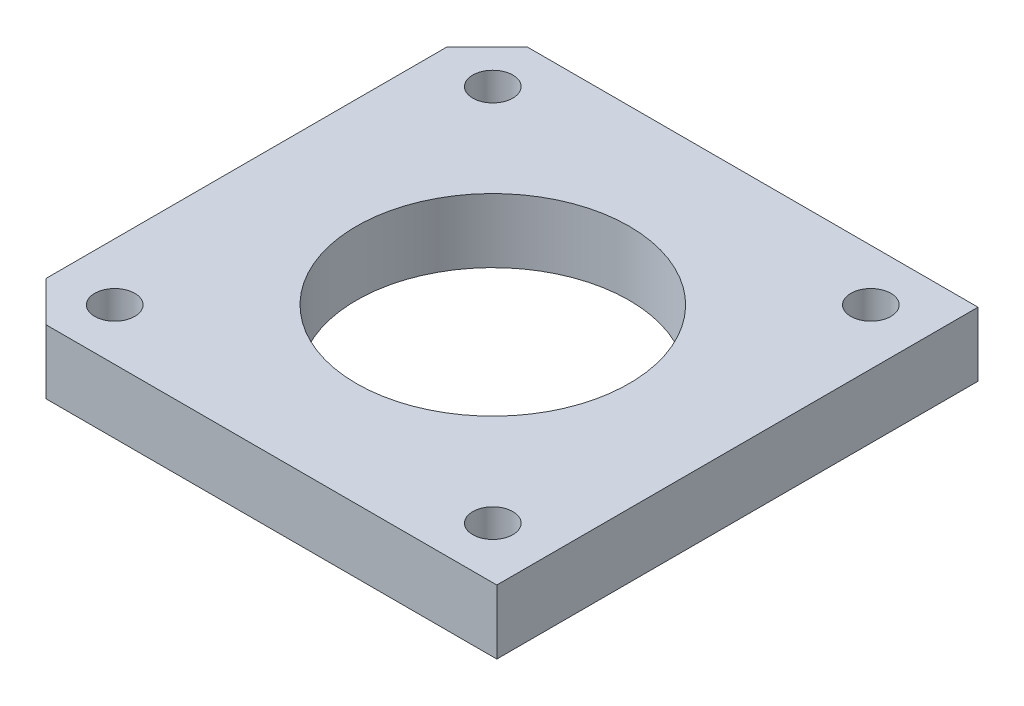
ISO-10303-21;
HEADER;
FILE_DESCRIPTION(('STEP AP214'),'2;1');
FILE_NAME('part.step','',(''),(''),'','','');
FILE_SCHEMA(('AUTOMOTIVE_DESIGN { 1 0 10303 214 1 1 1 1 }'));
ENDSEC;
DATA;
#1=APPLICATION_CONTEXT('core data for automotive mechanical design processes');
#2=APPLICATION_PROTOCOL_DEFINITION('international standard','automotive_design',2000,#1);
#3=PRODUCT_CONTEXT('',#1,'mechanical');
#4=PRODUCT('Part','Part','',(#3));
#5=PRODUCT_RELATED_PRODUCT_CATEGORY('part','',(#4));
#6=PRODUCT_DEFINITION_FORMATION('','',#4);
#7=PRODUCT_DEFINITION_CONTEXT('part definition',#1,'design');
#8=PRODUCT_DEFINITION('design','',#6,#7);
#9=PRODUCT_DEFINITION_SHAPE('','',#8);
#10=(LENGTH_UNIT() NAMED_UNIT(*) SI_UNIT(.MILLI.,.METRE.));
#11=(NAMED_UNIT(*) PLANE_ANGLE_UNIT() SI_UNIT($,.RADIAN.));
#12=(NAMED_UNIT(*) SI_UNIT($,.STERADIAN.) SOLID_ANGLE_UNIT());
#13=UNCERTAINTY_MEASURE_WITH_UNIT(LENGTH_MEASURE(1.E-05),#10,'distance_accuracy_value','');
#14=(GEOMETRIC_REPRESENTATION_CONTEXT(3) GLOBAL_UNCERTAINTY_ASSIGNED_CONTEXT((#13)) GLOBAL_UNIT_ASSIGNED_CONTEXT((#10,
#11,#12)) REPRESENTATION_CONTEXT('',''));
#15=CARTESIAN_POINT('',(0.,0.,0.));
#16=DIRECTION('',(0.,0.,1.));
#17=DIRECTION('',(1.,0.,0.));
#18=AXIS2_PLACEMENT_3D('',#15,#16,#17);
#19=CARTESIAN_POINT('',(42.5,8.,30.));
#20=DIRECTION('',(-1.,0.,0.));
#21=DIRECTION('',(0.,0.,1.));
#22=AXIS2_PLACEMENT_3D('',#19,#20,#21);
#23=PLANE('',#22);
#24=DIRECTION('',(0.,0.,-1.));
#25=VECTOR('',#24,1.);
#26=CARTESIAN_POINT('',(42.5,0.,30.));
#27=LINE('',#26,#25);
#28=CARTESIAN_POINT('',(42.5,0.,30.));
#29=VERTEX_POINT('',#28);
#30=CARTESIAN_POINT('',(42.5,0.,-30.));
#31=VERTEX_POINT('',#30);
#32=EDGE_CURVE('E103',#29,#31,#27,.T.);
#33=ORIENTED_EDGE('',*,*,#32,.T.);
#34=DIRECTION('',(0.,-1.,0.));
#35=VECTOR('',#34,1.);
#36=CARTESIAN_POINT('',(42.5,8.,-30.));
#37=LINE('',#36,#35);
#38=CARTESIAN_POINT('',(42.5,8.,-30.));
#39=VERTEX_POINT('',#38);
#40=EDGE_CURVE('E88',#39,#31,#37,.T.);
#41=ORIENTED_EDGE('',*,*,#40,.F.);
#42=DIRECTION('',(0.,0.,-1.));
#43=VECTOR('',#42,1.);
#44=CARTESIAN_POINT('',(42.5,8.,30.));
#45=LINE('',#44,#43);
#46=CARTESIAN_POINT('',(42.5,8.,30.));
#47=VERTEX_POINT('',#46);
#48=EDGE_CURVE('E92',#47,#39,#45,.T.);
#49=ORIENTED_EDGE('',*,*,#48,.F.);
#50=DIRECTION('',(0.,-1.,0.));
#51=VECTOR('',#50,1.);
#52=CARTESIAN_POINT('',(42.5,8.,30.));
#53=LINE('',#52,#51);
#54=EDGE_CURVE('E105',#47,#29,#53,.T.);
#55=ORIENTED_EDGE('',*,*,#54,.T.);
#56=EDGE_LOOP('',(#33,#41,#49,#55));
#57=FACE_BOUND('',#56,.T.);
#58=ADVANCED_FACE('F31',(#57),#23,.F.);
#59=CARTESIAN_POINT('',(-18.7102306116545,8.,-30.));
#60=DIRECTION('',(0.,0.,1.));
#61=DIRECTION('',(1.,0.,0.));
#62=AXIS2_PLACEMENT_3D('',#59,#60,#61);
#63=PLANE('',#62);
#64=DIRECTION('',(-1.,0.,0.));
#65=VECTOR('',#64,1.);
#66=CARTESIAN_POINT('',(-18.7102306116545,0.,-30.));
#67=LINE('',#66,#65);
#68=CARTESIAN_POINT('',(-13.7102306116545,0.,-30.));
#69=VERTEX_POINT('',#68);
#70=EDGE_CURVE('E131',#31,#69,#67,.T.);
#71=ORIENTED_EDGE('',*,*,#70,.T.);
#72=DIRECTION('',(0.,1.,0.));
#73=VECTOR('',#72,1.);
#74=CARTESIAN_POINT('',(-13.7102306116545,8.,-30.));
#75=LINE('',#74,#73);
#76=CARTESIAN_POINT('',(-13.7102306116545,8.,-30.));
#77=VERTEX_POINT('',#76);
#78=EDGE_CURVE('E54',#69,#77,#75,.T.);
#79=ORIENTED_EDGE('',*,*,#78,.T.);
#80=DIRECTION('',(-1.,0.,0.));
#81=VECTOR('',#80,1.);
#82=CARTESIAN_POINT('',(-18.7102306116545,8.,-30.));
#83=LINE('',#82,#81);
#84=EDGE_CURVE('E84',#39,#77,#83,.T.);
#85=ORIENTED_EDGE('',*,*,#84,.F.);
#86=ORIENTED_EDGE('',*,*,#40,.T.);
#87=EDGE_LOOP('',(#71,#79,#85,#86));
#88=FACE_BOUND('',#87,.T.);
#89=ADVANCED_FACE('F86',(#88),#63,.F.);
#90=CARTESIAN_POINT('',(-18.7102306116545,8.,30.));
#91=DIRECTION('',(1.,0.,0.));
#92=DIRECTION('',(0.,0.,-1.));
#93=AXIS2_PLACEMENT_3D('',#90,#91,#92);
#94=PLANE('',#93);
#95=DIRECTION('',(0.,0.,1.));
#96=VECTOR('',#95,1.);
#97=CARTESIAN_POINT('',(-18.7102306116545,8.,30.));
#98=LINE('',#97,#96);
#99=CARTESIAN_POINT('',(-18.7102306116545,8.,-25.));
#100=VERTEX_POINT('',#99);
#101=CARTESIAN_POINT('',(-18.7102306116545,8.,25.));
#102=VERTEX_POINT('',#101);
#103=EDGE_CURVE('E91',#100,#102,#98,.T.);
#104=ORIENTED_EDGE('',*,*,#103,.F.);
#105=DIRECTION('',(0.,-1.,0.));
#106=VECTOR('',#105,1.);
#107=CARTESIAN_POINT('',(-18.7102306116545,8.,-25.));
#108=LINE('',#107,#106);
#109=CARTESIAN_POINT('',(-18.7102306116545,0.,-25.));
#110=VERTEX_POINT('',#109);
#111=EDGE_CURVE('E107',#100,#110,#108,.T.);
#112=ORIENTED_EDGE('',*,*,#111,.T.);
#113=DIRECTION('',(0.,0.,1.));
#114=VECTOR('',#113,1.);
#115=CARTESIAN_POINT('',(-18.7102306116545,0.,30.));
#116=LINE('',#115,#114);
#117=CARTESIAN_POINT('',(-18.7102306116545,0.,25.));
#118=VERTEX_POINT('',#117);
#119=EDGE_CURVE('E132',#110,#118,#116,.T.);
#120=ORIENTED_EDGE('',*,*,#119,.T.);
#121=DIRECTION('',(0.,1.,0.));
#122=VECTOR('',#121,1.);
#123=CARTESIAN_POINT('',(-18.7102306116545,8.,25.));
#124=LINE('',#123,#122);
#125=EDGE_CURVE('E104',#118,#102,#124,.T.);
#126=ORIENTED_EDGE('',*,*,#125,.T.);
#127=EDGE_LOOP('',(#104,#112,#120,#126));
#128=FACE_BOUND('',#127,.T.);
#129=ADVANCED_FACE('F123',(#128),#94,.F.);
#130=CARTESIAN_POINT('',(-18.7102306116545,8.,30.));
#131=DIRECTION('',(0.,0.,-1.));
#132=DIRECTION('',(-1.,0.,0.));
#133=AXIS2_PLACEMENT_3D('',#130,#131,#132);
#134=PLANE('',#133);
#135=DIRECTION('',(1.,0.,0.));
#136=VECTOR('',#135,1.);
#137=CARTESIAN_POINT('',(-18.7102306116545,8.,30.));
#138=LINE('',#137,#136);
#139=CARTESIAN_POINT('',(-13.7102306116545,8.,30.));
#140=VERTEX_POINT('',#139);
#141=EDGE_CURVE('E96',#140,#47,#138,.T.);
#142=ORIENTED_EDGE('',*,*,#141,.F.);
#143=DIRECTION('',(0.,-1.,0.));
#144=VECTOR('',#143,1.);
#145=CARTESIAN_POINT('',(-13.7102306116545,8.,30.));
#146=LINE('',#145,#144);
#147=CARTESIAN_POINT('',(-13.7102306116545,0.,30.));
#148=VERTEX_POINT('',#147);
#149=EDGE_CURVE('E11',#140,#148,#146,.T.);
#150=ORIENTED_EDGE('',*,*,#149,.T.);
#151=DIRECTION('',(1.,0.,0.));
#152=VECTOR('',#151,1.);
#153=CARTESIAN_POINT('',(-18.7102306116545,0.,30.));
#154=LINE('',#153,#152);
#155=EDGE_CURVE('E100',#148,#29,#154,.T.);
#156=ORIENTED_EDGE('',*,*,#155,.T.);
#157=ORIENTED_EDGE('',*,*,#54,.F.);
#158=EDGE_LOOP('',(#142,#150,#156,#157));
#159=FACE_BOUND('',#158,.T.);
#160=ADVANCED_FACE('F140',(#159),#134,.F.);
#161=CARTESIAN_POINT('',(42.5,8.,-30.));
#162=DIRECTION('',(0.,-1.,0.));
#163=DIRECTION('',(0.,0.,-1.));
#164=AXIS2_PLACEMENT_3D('',#161,#162,#163);
#165=PLANE('',#164);
#166=CARTESIAN_POINT('',(35.57,8.,23.57));
#167=DIRECTION('',(0.,1.,0.));
#168=DIRECTION('',(0.,0.,1.));
#169=AXIS2_PLACEMENT_3D('',#166,#167,#168);
#170=CIRCLE('',#169,2.49999999999999);
#171=CARTESIAN_POINT('',(35.57,8.,26.07));
#172=VERTEX_POINT('',#171);
#173=EDGE_CURVE('E191',#172,#172,#170,.T.);
#174=ORIENTED_EDGE('',*,*,#173,.F.);
#175=EDGE_LOOP('',(#174));
#176=FACE_BOUND('',#175,.T.);
#177=CARTESIAN_POINT('',(-11.57,8.,23.57));
#178=DIRECTION('',(0.,1.,0.));
#179=DIRECTION('',(0.,0.,1.));
#180=AXIS2_PLACEMENT_3D('',#177,#178,#179);
#181=CIRCLE('',#180,2.5);
#182=CARTESIAN_POINT('',(-11.57,8.,26.07));
#183=VERTEX_POINT('',#182);
#184=EDGE_CURVE('E193',#183,#183,#181,.T.);
#185=ORIENTED_EDGE('',*,*,#184,.F.);
#186=EDGE_LOOP('',(#185));
#187=FACE_BOUND('',#186,.T.);
#188=CARTESIAN_POINT('',(35.57,8.,-23.57));
#189=DIRECTION('',(0.,1.,0.));
#190=DIRECTION('',(0.,0.,1.));
#191=AXIS2_PLACEMENT_3D('',#188,#189,#190);
#192=CIRCLE('',#191,2.49999999999999);
#193=CARTESIAN_POINT('',(35.57,8.,-21.07));
#194=VERTEX_POINT('',#193);
#195=EDGE_CURVE('E199',#194,#194,#192,.T.);
#196=ORIENTED_EDGE('',*,*,#195,.F.);
#197=EDGE_LOOP('',(#196));
#198=FACE_BOUND('',#197,.T.);
#199=CARTESIAN_POINT('',(-11.57,8.,-23.57));
#200=DIRECTION('',(0.,1.,0.));
#201=DIRECTION('',(0.,0.,1.));
#202=AXIS2_PLACEMENT_3D('',#199,#200,#201);
#203=CIRCLE('',#202,2.5);
#204=CARTESIAN_POINT('',(-11.57,8.,-21.07));
#205=VERTEX_POINT('',#204);
#206=EDGE_CURVE('E205',#205,#205,#203,.T.);
#207=ORIENTED_EDGE('',*,*,#206,.F.);
#208=EDGE_LOOP('',(#207));
#209=FACE_BOUND('',#208,.T.);
#210=CARTESIAN_POINT('',(12.,8.,0.));
#211=DIRECTION('',(0.,1.,0.));
#212=DIRECTION('',(0.,0.,1.));
#213=AXIS2_PLACEMENT_3D('',#210,#211,#212);
#214=CIRCLE('',#213,17.);
#215=CARTESIAN_POINT('',(12.,8.,17.));
#216=VERTEX_POINT('',#215);
#217=EDGE_CURVE('E211',#216,#216,#214,.T.);
#218=ORIENTED_EDGE('',*,*,#217,.F.);
#219=EDGE_LOOP('',(#218));
#220=FACE_BOUND('',#219,.T.);
#221=ORIENTED_EDGE('',*,*,#84,.T.);
#222=DIRECTION('',(0.707106781186549,0.,-0.707106781186546));
#223=VECTOR('',#222,1.);
#224=CARTESIAN_POINT('',(-18.7102306116545,8.,-25.));
#225=LINE('',#224,#223);
#226=EDGE_CURVE('E39',#77,#100,#225,.F.);
#227=ORIENTED_EDGE('',*,*,#226,.T.);
#228=ORIENTED_EDGE('',*,*,#103,.T.);
#229=DIRECTION('',(-0.707106781186546,0.,-0.707106781186549));
#230=VECTOR('',#229,1.);
#231=CARTESIAN_POINT('',(-13.7102306116545,8.,30.));
#232=LINE('',#231,#230);
#233=EDGE_CURVE('E46',#102,#140,#232,.F.);
#234=ORIENTED_EDGE('',*,*,#233,.T.);
#235=ORIENTED_EDGE('',*,*,#141,.T.);
#236=ORIENTED_EDGE('',*,*,#48,.T.);
#237=EDGE_LOOP('',(#221,#227,#228,#234,#235,#236));
#238=FACE_BOUND('',#237,.T.);
#239=ADVANCED_FACE('F95',(#176,#187,#198,#209,#220,#238),#165,.F.);
#240=CARTESIAN_POINT('',(42.5,0.,-30.));
#241=DIRECTION('',(0.,-1.,0.));
#242=DIRECTION('',(0.,0.,-1.));
#243=AXIS2_PLACEMENT_3D('',#240,#241,#242);
#244=PLANE('',#243);
#245=CARTESIAN_POINT('',(35.57,0.,23.57));
#246=DIRECTION('',(0.,1.,0.));
#247=DIRECTION('',(0.,0.,1.));
#248=AXIS2_PLACEMENT_3D('',#245,#246,#247);
#249=CIRCLE('',#248,2.49999999999999);
#250=CARTESIAN_POINT('',(35.57,0.,26.07));
#251=VERTEX_POINT('',#250);
#252=EDGE_CURVE('E188',#251,#251,#249,.T.);
#253=ORIENTED_EDGE('',*,*,#252,.T.);
#254=EDGE_LOOP('',(#253));
#255=FACE_BOUND('',#254,.T.);
#256=CARTESIAN_POINT('',(-11.57,0.,23.57));
#257=DIRECTION('',(0.,1.,0.));
#258=DIRECTION('',(0.,0.,1.));
#259=AXIS2_PLACEMENT_3D('',#256,#257,#258);
#260=CIRCLE('',#259,2.5);
#261=CARTESIAN_POINT('',(-11.57,0.,26.07));
#262=VERTEX_POINT('',#261);
#263=EDGE_CURVE('E196',#262,#262,#260,.T.);
#264=ORIENTED_EDGE('',*,*,#263,.T.);
#265=EDGE_LOOP('',(#264));
#266=FACE_BOUND('',#265,.T.);
#267=CARTESIAN_POINT('',(35.57,0.,-23.57));
#268=DIRECTION('',(0.,1.,0.));
#269=DIRECTION('',(0.,0.,1.));
#270=AXIS2_PLACEMENT_3D('',#267,#268,#269);
#271=CIRCLE('',#270,2.49999999999999);
#272=CARTESIAN_POINT('',(35.57,0.,-21.07));
#273=VERTEX_POINT('',#272);
#274=EDGE_CURVE('E202',#273,#273,#271,.T.);
#275=ORIENTED_EDGE('',*,*,#274,.T.);
#276=EDGE_LOOP('',(#275));
#277=FACE_BOUND('',#276,.T.);
#278=CARTESIAN_POINT('',(-11.57,0.,-23.57));
#279=DIRECTION('',(0.,1.,0.));
#280=DIRECTION('',(0.,0.,1.));
#281=AXIS2_PLACEMENT_3D('',#278,#279,#280);
#282=CIRCLE('',#281,2.5);
#283=CARTESIAN_POINT('',(-11.57,0.,-21.07));
#284=VERTEX_POINT('',#283);
#285=EDGE_CURVE('E208',#284,#284,#282,.T.);
#286=ORIENTED_EDGE('',*,*,#285,.T.);
#287=EDGE_LOOP('',(#286));
#288=FACE_BOUND('',#287,.T.);
#289=CARTESIAN_POINT('',(12.,0.,0.));
#290=DIRECTION('',(0.,1.,0.));
#291=DIRECTION('',(0.,0.,1.));
#292=AXIS2_PLACEMENT_3D('',#289,#290,#291);
#293=CIRCLE('',#292,17.);
#294=CARTESIAN_POINT('',(12.,0.,17.));
#295=VERTEX_POINT('',#294);
#296=EDGE_CURVE('E135',#295,#295,#293,.T.);
#297=ORIENTED_EDGE('',*,*,#296,.T.);
#298=EDGE_LOOP('',(#297));
#299=FACE_BOUND('',#298,.T.);
#300=ORIENTED_EDGE('',*,*,#119,.F.);
#301=DIRECTION('',(-0.707106781186549,0.,0.707106781186546));
#302=VECTOR('',#301,1.);
#303=CARTESIAN_POINT('',(14.3948846941728,0.,-58.1051153058273));
#304=LINE('',#303,#302);
#305=EDGE_CURVE('E116',#110,#69,#304,.F.);
#306=ORIENTED_EDGE('',*,*,#305,.T.);
#307=ORIENTED_EDGE('',*,*,#70,.F.);
#308=ORIENTED_EDGE('',*,*,#32,.F.);
#309=ORIENTED_EDGE('',*,*,#155,.F.);
#310=DIRECTION('',(0.707106781186546,0.,0.707106781186549));
#311=VECTOR('',#310,1.);
#312=CARTESIAN_POINT('',(-15.6051153058274,0.,28.1051153058271));
#313=LINE('',#312,#311);
#314=EDGE_CURVE('E114',#148,#118,#313,.F.);
#315=ORIENTED_EDGE('',*,*,#314,.T.);
#316=EDGE_LOOP('',(#300,#306,#307,#308,#309,#315));
#317=FACE_BOUND('',#316,.T.);
#318=ADVANCED_FACE('F130',(#255,#266,#277,#288,#299,#317),#244,.T.);
#319=CARTESIAN_POINT('',(-18.7102306116545,8.,-25.));
#320=DIRECTION('',(0.707106781186546,0.,0.707106781186549));
#321=DIRECTION('',(0.707106781186549,0.,-0.707106781186546));
#322=AXIS2_PLACEMENT_3D('',#319,#320,#321);
#323=PLANE('',#322);
#324=ORIENTED_EDGE('',*,*,#226,.F.);
#325=ORIENTED_EDGE('',*,*,#78,.F.);
#326=ORIENTED_EDGE('',*,*,#305,.F.);
#327=ORIENTED_EDGE('',*,*,#111,.F.);
#328=EDGE_LOOP('',(#324,#325,#326,#327));
#329=FACE_BOUND('',#328,.T.);
#330=ADVANCED_FACE('F128',(#329),#323,.F.);
#331=CARTESIAN_POINT('',(-13.7102306116545,8.,30.));
#332=DIRECTION('',(0.707106781186549,0.,-0.707106781186546));
#333=DIRECTION('',(-0.707106781186546,0.,-0.707106781186549));
#334=AXIS2_PLACEMENT_3D('',#331,#332,#333);
#335=PLANE('',#334);
#336=ORIENTED_EDGE('',*,*,#233,.F.);
#337=ORIENTED_EDGE('',*,*,#125,.F.);
#338=ORIENTED_EDGE('',*,*,#314,.F.);
#339=ORIENTED_EDGE('',*,*,#149,.F.);
#340=EDGE_LOOP('',(#336,#337,#338,#339));
#341=FACE_BOUND('',#340,.T.);
#342=ADVANCED_FACE('F33',(#341),#335,.F.);
#343=CARTESIAN_POINT('',(12.,0.,0.));
#344=DIRECTION('',(0.,1.,0.));
#345=DIRECTION('',(0.,0.,1.));
#346=AXIS2_PLACEMENT_3D('',#343,#344,#345);
#347=CYLINDRICAL_SURFACE('',#346,17.);
#348=ORIENTED_EDGE('',*,*,#296,.F.);
#349=EDGE_LOOP('',(#348));
#350=FACE_BOUND('',#349,.T.);
#351=ORIENTED_EDGE('',*,*,#217,.T.);
#352=EDGE_LOOP('',(#351));
#353=FACE_BOUND('',#352,.T.);
#354=ADVANCED_FACE('F144',(#350,#353),#347,.F.);
#355=CARTESIAN_POINT('',(-11.57,0.,-23.57));
#356=DIRECTION('',(0.,1.,0.));
#357=DIRECTION('',(0.,0.,1.));
#358=AXIS2_PLACEMENT_3D('',#355,#356,#357);
#359=CYLINDRICAL_SURFACE('',#358,2.5);
#360=ORIENTED_EDGE('',*,*,#285,.F.);
#361=EDGE_LOOP('',(#360));
#362=FACE_BOUND('',#361,.T.);
#363=ORIENTED_EDGE('',*,*,#206,.T.);
#364=EDGE_LOOP('',(#363));
#365=FACE_BOUND('',#364,.T.);
#366=ADVANCED_FACE('F149',(#362,#365),#359,.F.);
#367=CARTESIAN_POINT('',(35.57,0.,-23.57));
#368=DIRECTION('',(0.,1.,0.));
#369=DIRECTION('',(0.,0.,1.));
#370=AXIS2_PLACEMENT_3D('',#367,#368,#369);
#371=CYLINDRICAL_SURFACE('',#370,2.49999999999999);
#372=ORIENTED_EDGE('',*,*,#274,.F.);
#373=EDGE_LOOP('',(#372));
#374=FACE_BOUND('',#373,.T.);
#375=ORIENTED_EDGE('',*,*,#195,.T.);
#376=EDGE_LOOP('',(#375));
#377=FACE_BOUND('',#376,.T.);
#378=ADVANCED_FACE('F171',(#374,#377),#371,.F.);
#379=CARTESIAN_POINT('',(-11.57,0.,23.57));
#380=DIRECTION('',(0.,1.,0.));
#381=DIRECTION('',(0.,0.,1.));
#382=AXIS2_PLACEMENT_3D('',#379,#380,#381);
#383=CYLINDRICAL_SURFACE('',#382,2.5);
#384=ORIENTED_EDGE('',*,*,#263,.F.);
#385=EDGE_LOOP('',(#384));
#386=FACE_BOUND('',#385,.T.);
#387=ORIENTED_EDGE('',*,*,#184,.T.);
#388=EDGE_LOOP('',(#387));
#389=FACE_BOUND('',#388,.T.);
#390=ADVANCED_FACE('F175',(#386,#389),#383,.F.);
#391=CARTESIAN_POINT('',(35.57,0.,23.57));
#392=DIRECTION('',(0.,1.,0.));
#393=DIRECTION('',(0.,0.,1.));
#394=AXIS2_PLACEMENT_3D('',#391,#392,#393);
#395=CYLINDRICAL_SURFACE('',#394,2.49999999999999);
#396=ORIENTED_EDGE('',*,*,#252,.F.);
#397=EDGE_LOOP('',(#396));
#398=FACE_BOUND('',#397,.T.);
#399=ORIENTED_EDGE('',*,*,#173,.T.);
#400=EDGE_LOOP('',(#399));
#401=FACE_BOUND('',#400,.T.);
#402=ADVANCED_FACE('F179',(#398,#401),#395,.F.);
#403=CLOSED_SHELL('',(#58,#89,#129,#160,#239,#318,#330,#342,#354,#366,#378,#390,#402));
#404=MANIFOLD_SOLID_BREP('B2',#403);
#405=ADVANCED_BREP_SHAPE_REPRESENTATION('',(#18,#404),#14);
#406=SHAPE_DEFINITION_REPRESENTATION(#9,#405);
ENDSEC;
END-ISO-10303-21;
